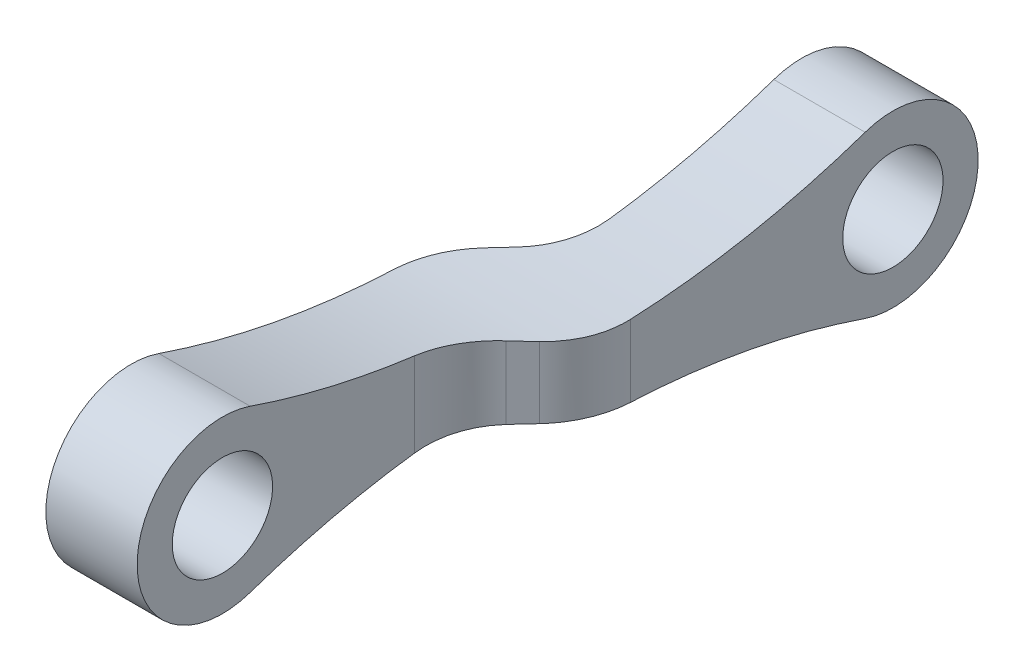
ISO-10303-21;
HEADER;
FILE_DESCRIPTION(('STEP AP214'),'2;1');
FILE_NAME('part.step','',(''),(''),'','','');
FILE_SCHEMA(('AUTOMOTIVE_DESIGN { 1 0 10303 214 1 1 1 1 }'));
ENDSEC;
DATA;
#1=APPLICATION_CONTEXT('core data for automotive mechanical design processes');
#2=APPLICATION_PROTOCOL_DEFINITION('international standard','automotive_design',2000,#1);
#3=PRODUCT_CONTEXT('',#1,'mechanical');
#4=PRODUCT('Part','Part','',(#3));
#5=PRODUCT_RELATED_PRODUCT_CATEGORY('part','',(#4));
#6=PRODUCT_DEFINITION_FORMATION('','',#4);
#7=PRODUCT_DEFINITION_CONTEXT('part definition',#1,'design');
#8=PRODUCT_DEFINITION('design','',#6,#7);
#9=PRODUCT_DEFINITION_SHAPE('','',#8);
#10=(LENGTH_UNIT() NAMED_UNIT(*) SI_UNIT(.MILLI.,.METRE.));
#11=(NAMED_UNIT(*) PLANE_ANGLE_UNIT() SI_UNIT($,.RADIAN.));
#12=(NAMED_UNIT(*) SI_UNIT($,.STERADIAN.) SOLID_ANGLE_UNIT());
#13=UNCERTAINTY_MEASURE_WITH_UNIT(LENGTH_MEASURE(1.E-05),#10,'distance_accuracy_value','');
#14=(GEOMETRIC_REPRESENTATION_CONTEXT(3) GLOBAL_UNCERTAINTY_ASSIGNED_CONTEXT((#13)) GLOBAL_UNIT_ASSIGNED_CONTEXT((#10,
#11,#12)) REPRESENTATION_CONTEXT('',''));
#15=CARTESIAN_POINT('',(0.,0.,0.));
#16=DIRECTION('',(0.,0.,1.));
#17=DIRECTION('',(1.,0.,0.));
#18=AXIS2_PLACEMENT_3D('',#15,#16,#17);
#19=CARTESIAN_POINT('',(11.5,31.0577521008403,10.68));
#20=DIRECTION('',(1.,0.,0.));
#21=DIRECTION('',(0.,0.,-1.));
#22=AXIS2_PLACEMENT_3D('',#19,#20,#21);
#23=PLANE('',#22);
#24=CARTESIAN_POINT('',(11.5,62.1155042016806,21.36));
#25=DIRECTION('',(-1.,0.,0.));
#26=DIRECTION('',(0.,0.,-1.));
#27=AXIS2_PLACEMENT_3D('',#24,#25,#26);
#28=CIRCLE('',#27,59.6155042016806);
#29=CARTESIAN_POINT('',(11.5,5.74009616104241,1.97387843141019));
#30=VERTEX_POINT('',#29);
#31=CARTESIAN_POINT('',(11.5,2.56082858975971,18.6676118445749));
#32=VERTEX_POINT('',#31);
#33=EDGE_CURVE('E325',#30,#32,#28,.T.);
#34=ORIENTED_EDGE('',*,*,#33,.T.);
#35=DIRECTION('',(0.,1.,0.));
#36=VECTOR('',#35,1.);
#37=CARTESIAN_POINT('',(11.5,-2.5,18.6676118445749));
#38=LINE('',#37,#36);
#39=CARTESIAN_POINT('',(11.5,-2.56082858975971,18.6676118445749));
#40=VERTEX_POINT('',#39);
#41=EDGE_CURVE('E60',#32,#40,#38,.F.);
#42=ORIENTED_EDGE('',*,*,#41,.T.);
#43=CARTESIAN_POINT('',(11.5,-62.1155042016806,21.36));
#44=DIRECTION('',(-1.,0.,0.));
#45=DIRECTION('',(0.,0.,1.));
#46=AXIS2_PLACEMENT_3D('',#43,#44,#45);
#47=CIRCLE('',#46,59.6155042016806);
#48=CARTESIAN_POINT('',(11.5,-5.74009616104242,1.97387843141018));
#49=VERTEX_POINT('',#48);
#50=EDGE_CURVE('E328',#40,#49,#47,.T.);
#51=ORIENTED_EDGE('',*,*,#50,.T.);
#52=CARTESIAN_POINT('',(11.5,0.,0.));
#53=DIRECTION('',(1.,0.,0.));
#54=DIRECTION('',(0.,0.,-1.));
#55=AXIS2_PLACEMENT_3D('',#52,#53,#54);
#56=CIRCLE('',#55,6.07000000000002);
#57=EDGE_CURVE('E331',#49,#30,#56,.T.);
#58=ORIENTED_EDGE('',*,*,#57,.T.);
#59=EDGE_LOOP('',(#34,#42,#51,#58));
#60=FACE_BOUND('',#59,.T.);
#61=CARTESIAN_POINT('',(11.5,0.,0.));
#62=DIRECTION('',(1.,0.,0.));
#63=DIRECTION('',(0.,0.,-1.));
#64=AXIS2_PLACEMENT_3D('',#61,#62,#63);
#65=CIRCLE('',#64,3.57);
#66=CARTESIAN_POINT('',(11.5,0.,-3.57));
#67=VERTEX_POINT('',#66);
#68=EDGE_CURVE('E288',#67,#67,#65,.T.);
#69=ORIENTED_EDGE('',*,*,#68,.F.);
#70=EDGE_LOOP('',(#69));
#71=FACE_BOUND('',#70,.T.);
#72=ADVANCED_FACE('F38',(#60,#71),#23,.T.);
#73=CARTESIAN_POINT('',(0.,31.0577521008403,10.68));
#74=DIRECTION('',(1.,0.,0.));
#75=DIRECTION('',(0.,0.,-1.));
#76=AXIS2_PLACEMENT_3D('',#73,#74,#75);
#77=PLANE('',#76);
#78=CARTESIAN_POINT('',(0.,62.1155042016806,21.36));
#79=DIRECTION('',(-1.,0.,0.));
#80=DIRECTION('',(0.,0.,-1.));
#81=AXIS2_PLACEMENT_3D('',#78,#79,#80);
#82=CIRCLE('',#81,59.6155042016806);
#83=CARTESIAN_POINT('',(0.,2.55818640429047,23.9932941349716));
#84=VERTEX_POINT('',#83);
#85=CARTESIAN_POINT('',(0.,5.74009616104237,40.7461215685898));
#86=VERTEX_POINT('',#85);
#87=EDGE_CURVE('E279',#84,#86,#82,.T.);
#88=ORIENTED_EDGE('',*,*,#87,.F.);
#89=DIRECTION('',(0.,1.,0.));
#90=VECTOR('',#89,1.);
#91=CARTESIAN_POINT('',(0.,31.0577521008403,23.9932941349716));
#92=LINE('',#91,#90);
#93=CARTESIAN_POINT('',(0.,-2.55818640429048,23.9932941349716));
#94=VERTEX_POINT('',#93);
#95=EDGE_CURVE('E274',#84,#94,#92,.F.);
#96=ORIENTED_EDGE('',*,*,#95,.T.);
#97=CARTESIAN_POINT('',(0.,-62.1155042016806,21.36));
#98=DIRECTION('',(-1.,0.,0.));
#99=DIRECTION('',(0.,0.,1.));
#100=AXIS2_PLACEMENT_3D('',#97,#98,#99);
#101=CIRCLE('',#100,59.6155042016806);
#102=CARTESIAN_POINT('',(0.,-5.74009616104239,40.7461215685898));
#103=VERTEX_POINT('',#102);
#104=EDGE_CURVE('E292',#103,#94,#101,.T.);
#105=ORIENTED_EDGE('',*,*,#104,.F.);
#106=CARTESIAN_POINT('',(0.,0.,42.72));
#107=DIRECTION('',(1.,0.,0.));
#108=DIRECTION('',(0.,0.,-1.));
#109=AXIS2_PLACEMENT_3D('',#106,#107,#108);
#110=CIRCLE('',#109,6.06999999999999);
#111=EDGE_CURVE('E160',#86,#103,#110,.T.);
#112=ORIENTED_EDGE('',*,*,#111,.F.);
#113=EDGE_LOOP('',(#88,#96,#105,#112));
#114=FACE_BOUND('',#113,.T.);
#115=CARTESIAN_POINT('',(0.,0.,42.72));
#116=DIRECTION('',(1.,0.,0.));
#117=DIRECTION('',(0.,0.,-1.));
#118=AXIS2_PLACEMENT_3D('',#115,#116,#117);
#119=CIRCLE('',#118,3.57);
#120=CARTESIAN_POINT('',(0.,0.,39.15));
#121=VERTEX_POINT('',#120);
#122=EDGE_CURVE('E318',#121,#121,#119,.T.);
#123=ORIENTED_EDGE('',*,*,#122,.T.);
#124=EDGE_LOOP('',(#123));
#125=FACE_BOUND('',#124,.T.);
#126=ADVANCED_FACE('F214',(#114,#125),#77,.F.);
#127=CARTESIAN_POINT('',(11.5,62.1155042016806,21.36));
#128=DIRECTION('',(-1.,0.,0.));
#129=DIRECTION('',(0.,0.,1.));
#130=AXIS2_PLACEMENT_3D('',#127,#128,#129);
#131=CYLINDRICAL_SURFACE('',#130,59.6155042016806);
#132=CARTESIAN_POINT('',(-0.0590940204535061,62.1155042016806,21.36));
#133=DIRECTION('',(0.707106781186549,0.,0.707106781186546));
#134=DIRECTION('',(-0.707106781186546,0.,0.707106781186549));
#135=AXIS2_PLACEMENT_3D('',#132,#133,#134);
#136=ELLIPSE('',#135,84.3090545697268,59.6155042016806);
#137=CARTESIAN_POINT('',(3.09619407771257,2.58355901056349,18.204711901834));
#138=VERTEX_POINT('',#137);
#139=CARTESIAN_POINT('',(1.90380592228744,2.53232398246615,19.3971000572591));
#140=VERTEX_POINT('',#139);
#141=EDGE_CURVE('E281',#138,#140,#136,.F.);
#142=ORIENTED_EDGE('',*,*,#141,.T.);
#143=CARTESIAN_POINT('',(1.90380592228743,2.53232398246615,19.3971000572591));
#144=CARTESIAN_POINT('',(1.77499707379957,2.52807908157983,19.5258816176791));
#145=CARTESIAN_POINT('',(1.65162583039582,2.52407728502969,19.6601063788568));
#146=CARTESIAN_POINT('',(1.41656618937471,2.51678927245583,19.9384433693172));
#147=CARTESIAN_POINT('',(1.3048778930099,2.51350306263361,20.0825556842744));
#148=CARTESIAN_POINT('',(1.0939115073686,2.50787347447107,20.3797828642251));
#149=CARTESIAN_POINT('',(0.994643200635603,2.50553083614724,20.5329046876832));
#150=CARTESIAN_POINT('',(0.809326883675707,2.50200094297654,20.8469510973131));
#151=CARTESIAN_POINT('',(0.723278143556792,2.50081362432167,21.0078752520488));
#152=CARTESIAN_POINT('',(0.56494398448552,2.49977797404695,21.3365273506703));
#153=CARTESIAN_POINT('',(0.49267007767478,2.49993075743022,21.5042608446149));
#154=CARTESIAN_POINT('',(0.362491207977645,2.50173085566118,21.8452062707204));
#155=CARTESIAN_POINT('',(0.304586133934346,2.50337815894684,22.0184181604889));
#156=CARTESIAN_POINT('',(0.203648732968843,2.50827818485279,22.3687529402186));
#157=CARTESIAN_POINT('',(0.160589407884079,2.51152796679201,22.5458681007442));
#158=CARTESIAN_POINT('',(0.0895134439839548,2.51970379952949,22.9029804806161));
#159=CARTESIAN_POINT('',(0.0614895816375497,2.52462904351881,23.0829762731294));
#160=CARTESIAN_POINT('',(0.027379904361948,2.53427742196616,23.3849609010242));
#161=CARTESIAN_POINT('',(0.0171073287550954,2.53853177341081,23.5065080296951));
#162=CARTESIAN_POINT('',(0.00342060141856039,2.54779463893131,23.7498030339737));
#163=CARTESIAN_POINT('',(-2.30212156742511E-06,2.5528021818443,23.8715504542422));
#164=CARTESIAN_POINT('',(0.,2.55818640429047,23.9932941349716));
#165=B_SPLINE_CURVE_WITH_KNOTS('',3,(#143,#144,#145,#146,#147,#148,#149,#150,#151,#152,#153,
#154,#155,#156,#157,#158,#159,#160,#161,#162,#163,#164),.UNSPECIFIED.,.F.,.F.,(4,2,2,2,2,2,2,2,
2,2,4),(0.,0.546416077265279,1.09283688976022,1.63968541413357,2.18650373449626,
2.73377706642366,3.2810461645273,3.82731469512343,4.37332054479895,4.73930213279695,
5.10481580761997),.UNSPECIFIED.);
#166=EDGE_CURVE('E203',#140,#84,#165,.T.);
#167=ORIENTED_EDGE('',*,*,#166,.T.);
#168=ORIENTED_EDGE('',*,*,#87,.T.);
#169=DIRECTION('',(-1.,0.,0.));
#170=VECTOR('',#169,1.);
#171=CARTESIAN_POINT('',(11.5,5.74009616104237,40.7461215685898));
#172=LINE('',#171,#170);
#173=CARTESIAN_POINT('',(6.5,5.74009616104237,40.7461215685898));
#174=VERTEX_POINT('',#173);
#175=EDGE_CURVE('E163',#174,#86,#172,.T.);
#176=ORIENTED_EDGE('',*,*,#175,.F.);
#177=CARTESIAN_POINT('',(6.5,62.1155042016806,21.36));
#178=DIRECTION('',(-1.,0.,0.));
#179=DIRECTION('',(0.,0.,1.));
#180=AXIS2_PLACEMENT_3D('',#177,#178,#179);
#181=CIRCLE('',#180,59.6155042016806);
#182=CARTESIAN_POINT('',(6.5,2.9983704273942,29.0523881554252));
#183=VERTEX_POINT('',#182);
#184=EDGE_CURVE('E152',#174,#183,#181,.F.);
#185=ORIENTED_EDGE('',*,*,#184,.T.);
#186=CARTESIAN_POINT('',(6.5,2.9983704273942,29.0523881554252));
#187=CARTESIAN_POINT('',(6.49998033445621,2.97473937083614,28.8708449321185));
#188=CARTESIAN_POINT('',(6.50760497315867,2.95196069175335,28.6891890934745));
#189=CARTESIAN_POINT('',(6.53805889459466,2.90821365764182,28.3269296185915));
#190=CARTESIAN_POINT('',(6.56088880383312,2.88724537724741,28.1463260260177));
#191=CARTESIAN_POINT('',(6.6216959220554,2.84720913945275,27.7873064049504));
#192=CARTESIAN_POINT('',(6.65968638783377,2.82814286350289,27.6088924322289));
#193=CARTESIAN_POINT('',(6.75058382056682,2.79198108786003,27.2557135473987));
#194=CARTESIAN_POINT('',(6.80348980911703,2.77488545900328,27.0809483967478));
#195=CARTESIAN_POINT('',(6.92394390092746,2.74265444414829,26.7361576033529));
#196=CARTESIAN_POINT('',(6.99150635967117,2.72752100342686,26.5661367931066));
#197=CARTESIAN_POINT('',(7.14079146330185,2.69919771418741,26.2322617477932));
#198=CARTESIAN_POINT('',(7.2225139811018,2.68600784822769,26.0684074573973));
#199=CARTESIAN_POINT('',(7.39938703265318,2.66152016643046,25.7483752494452));
#200=CARTESIAN_POINT('',(7.49451202760224,2.65021883944708,25.5921834767144));
#201=CARTESIAN_POINT('',(7.69760464661975,2.62937499335367,25.2883518337271));
#202=CARTESIAN_POINT('',(7.80556598921076,2.6198316197689,25.1407078327792));
#203=CARTESIAN_POINT('',(7.99516950567496,2.60530664677979,24.9031266281022));
#204=CARTESIAN_POINT('',(8.07343258612251,2.59987106154216,24.8104988504264));
#205=CARTESIAN_POINT('',(8.2349318485822,2.5896731522277,24.6298559518194));
#206=CARTESIAN_POINT('',(8.31816166326589,2.58490999140951,24.541835185506));
#207=CARTESIAN_POINT('',(8.4038059222874,2.58045634368577,24.4561940777127));
#208=B_SPLINE_CURVE_WITH_KNOTS('',3,(#186,#187,#188,#189,#190,#191,#192,#193,#194,#195,#196,
#197,#198,#199,#200,#201,#202,#203,#204,#205,#206,#207),.UNSPECIFIED.,.F.,.F.,(4,2,2,2,2,2,2,2,
2,2,4),(0.,0.549066119188704,1.09815486302658,1.64772480047779,2.19725869650866,
2.74733329114686,3.29740294910194,3.8464382641544,4.3952060056157,4.75918571474846,
5.12270843081804),.UNSPECIFIED.);
#209=CARTESIAN_POINT('',(8.40380592228742,2.58045634368576,24.4561940777126));
#210=VERTEX_POINT('',#209);
#211=EDGE_CURVE('E53',#183,#210,#208,.T.);
#212=ORIENTED_EDGE('',*,*,#211,.T.);
#213=CARTESIAN_POINT('',(11.5,62.1155042016806,21.36));
#214=DIRECTION('',(-0.707106781186553,0.,-0.707106781186542));
#215=DIRECTION('',(-0.707106781186542,0.,0.707106781186553));
#216=AXIS2_PLACEMENT_3D('',#213,#214,#215);
#217=ELLIPSE('',#216,84.3090545697262,59.6155042016806);
#218=CARTESIAN_POINT('',(9.59619407771262,2.53040653262528,23.2638059222874));
#219=VERTEX_POINT('',#218);
#220=EDGE_CURVE('E311',#210,#219,#217,.F.);
#221=ORIENTED_EDGE('',*,*,#220,.T.);
#222=CARTESIAN_POINT('',(9.5961940777126,2.53040653262528,23.2638059222874));
#223=CARTESIAN_POINT('',(9.72499968700732,2.52628959306561,23.1350276214524));
#224=CARTESIAN_POINT('',(9.84836791142831,2.52242110869448,23.0008064062285));
#225=CARTESIAN_POINT('',(10.0834219154513,2.51540941983826,22.7224772990121));
#226=CARTESIAN_POINT('',(10.1951075952543,2.5122662215487,22.5783693225786));
#227=CARTESIAN_POINT('',(10.4060687110771,2.50693147626502,22.2811524049213));
#228=CARTESIAN_POINT('',(10.5053344156984,2.50474067221393,22.1280365421561));
#229=CARTESIAN_POINT('',(10.690646109424,2.5015220470532,21.8140033304311));
#230=CARTESIAN_POINT('',(10.776692828137,2.5004941617375,21.653086412688));
#231=CARTESIAN_POINT('',(10.9350236353535,2.49978397596739,21.3244504106536));
#232=CARTESIAN_POINT('',(11.0072962224896,2.50010279490777,21.1567257824405));
#233=CARTESIAN_POINT('',(11.1374734991478,2.50224023469482,20.8157997524411));
#234=CARTESIAN_POINT('',(11.1953782988873,2.5040588440359,20.6425983926791));
#235=CARTESIAN_POINT('',(11.2963166336608,2.50930519591122,20.292286087515));
#236=CARTESIAN_POINT('',(11.3393771379696,2.51272999328712,20.1151828608154));
#237=CARTESIAN_POINT('',(11.4104572085034,2.52125854898121,19.758096019308));
#238=CARTESIAN_POINT('',(11.438483994316,2.52636149950342,19.5781138298961));
#239=CARTESIAN_POINT('',(11.4726052343011,2.53630931925915,19.2761100218506));
#240=CARTESIAN_POINT('',(11.4828834221015,2.54068528237763,19.154529451717));
#241=CARTESIAN_POINT('',(11.4965775766205,2.55019203853176,18.9111681877307));
#242=CARTESIAN_POINT('',(11.5000023063316,2.55532185864257,18.7893879489488));
#243=CARTESIAN_POINT('',(11.5,2.56082858975971,18.6676118445749));
#244=B_SPLINE_CURVE_WITH_KNOTS('',3,(#222,#223,#224,#225,#226,#227,#228,#229,#230,#231,#232,
#233,#234,#235,#236,#237,#238,#239,#240,#241,#242,#243),.UNSPECIFIED.,.F.,.F.,(4,2,2,2,2,2,2,2,
2,2,4),(0.,0.546393490601046,1.09279164842697,1.63961527861437,2.18640871657284,2.7336567443987,
3.28090057406918,3.82714485966285,4.3731265889808,4.739222236412,5.10484948549957),.UNSPECIFIED.);
#245=EDGE_CURVE('E195',#219,#32,#244,.T.);
#246=ORIENTED_EDGE('',*,*,#245,.T.);
#247=ORIENTED_EDGE('',*,*,#33,.F.);
#248=DIRECTION('',(-1.,0.,0.));
#249=VECTOR('',#248,1.);
#250=CARTESIAN_POINT('',(11.5,5.74009616104241,1.97387843141019));
#251=LINE('',#250,#249);
#252=CARTESIAN_POINT('',(5.,5.74009616104241,1.97387843141019));
#253=VERTEX_POINT('',#252);
#254=EDGE_CURVE('E171',#30,#253,#251,.T.);
#255=ORIENTED_EDGE('',*,*,#254,.T.);
#256=CARTESIAN_POINT('',(5.,62.1155042016806,21.36));
#257=DIRECTION('',(1.,0.,0.));
#258=DIRECTION('',(0.,0.,-1.));
#259=AXIS2_PLACEMENT_3D('',#256,#257,#258);
#260=CIRCLE('',#259,59.6155042016806);
#261=CARTESIAN_POINT('',(5.,3.00608984747105,13.6085178241214));
#262=VERTEX_POINT('',#261);
#263=EDGE_CURVE('E301',#253,#262,#260,.F.);
#264=ORIENTED_EDGE('',*,*,#263,.T.);
#265=CARTESIAN_POINT('',(5.,3.00608984747105,13.6085178241214));
#266=CARTESIAN_POINT('',(5.00001965560204,2.98227369150359,13.7900649792087));
#267=CARTESIAN_POINT('',(4.99239469586501,2.9593100520927,13.9717256816289));
#268=CARTESIAN_POINT('',(4.96193897101887,2.91519463726919,14.3339969012155));
#269=CARTESIAN_POINT('',(4.93910756843819,2.89404293785714,14.5146073740348));
#270=CARTESIAN_POINT('',(4.87829557558409,2.85364243099122,14.8736437633579));
#271=CARTESIAN_POINT('',(4.84030163463379,2.83439531922268,15.0520676114461));
#272=CARTESIAN_POINT('',(4.74939483208519,2.79787606181507,15.4052678495778));
#273=CARTESIAN_POINT('',(4.69648295204889,2.7806037863419,15.5800444787865));
#274=CARTESIAN_POINT('',(4.57601393355463,2.74802469012818,15.924860130624));
#275=CARTESIAN_POINT('',(4.50844238117828,2.73271982757431,16.09489430327));
#276=CARTESIAN_POINT('',(4.3591356892656,2.70406040319475,16.4287966703125));
#277=CARTESIAN_POINT('',(4.27740067833853,2.69070582366182,16.5926649206813));
#278=CARTESIAN_POINT('',(4.10049927433063,2.66589693979961,16.9127244685842));
#279=CARTESIAN_POINT('',(4.00535846561937,2.654439104163,17.0689296424749));
#280=CARTESIAN_POINT('',(3.80223058969418,2.63329124872846,17.3727872324465));
#281=CARTESIAN_POINT('',(3.69424980978996,2.62360036955173,17.520443782268));
#282=CARTESIAN_POINT('',(3.50465503699426,2.60884179534635,17.7579893543268));
#283=CARTESIAN_POINT('',(3.42642420425118,2.60331689687534,17.8505718797216));
#284=CARTESIAN_POINT('',(3.26499354204235,2.59294435663301,18.0311289135854));
#285=CARTESIAN_POINT('',(3.18180006768143,2.58809587414601,18.1191090557365));
#286=CARTESIAN_POINT('',(3.09619407771257,2.5835590105635,18.204711901834));
#287=B_SPLINE_CURVE_WITH_KNOTS('',3,(#265,#266,#267,#268,#269,#270,#271,#272,#273,#274,#275,
#276,#277,#278,#279,#280,#281,#282,#283,#284,#285,#286),.UNSPECIFIED.,.F.,.F.,(4,2,2,2,2,2,2,2,
2,2,4),(0.,0.549149846456014,1.09832271535389,1.64798020386502,2.19760153476485,
2.74776574233622,3.29792495448218,3.84704808588954,4.39590342861602,4.75972951919093,
5.12309930396841),.UNSPECIFIED.);
#288=EDGE_CURVE('E223',#262,#138,#287,.T.);
#289=ORIENTED_EDGE('',*,*,#288,.T.);
#290=EDGE_LOOP('',(#142,#167,#168,#176,#185,#212,#221,#246,#247,#255,#264,#289));
#291=FACE_BOUND('',#290,.T.);
#292=ADVANCED_FACE('F210',(#291),#131,.F.);
#293=CARTESIAN_POINT('',(11.5,0.,42.72));
#294=DIRECTION('',(-1.,0.,0.));
#295=DIRECTION('',(0.,0.,1.));
#296=AXIS2_PLACEMENT_3D('',#293,#294,#295);
#297=CYLINDRICAL_SURFACE('',#296,6.06999999999999);
#298=DIRECTION('',(-1.,0.,0.));
#299=VECTOR('',#298,1.);
#300=CARTESIAN_POINT('',(11.5,-5.74009616104239,40.7461215685898));
#301=LINE('',#300,#299);
#302=CARTESIAN_POINT('',(6.5,-5.74009616104238,40.7461215685898));
#303=VERTEX_POINT('',#302);
#304=EDGE_CURVE('E138',#303,#103,#301,.T.);
#305=ORIENTED_EDGE('',*,*,#304,.F.);
#306=CARTESIAN_POINT('',(6.5,0.,42.72));
#307=DIRECTION('',(-1.,0.,0.));
#308=DIRECTION('',(0.,0.,1.));
#309=AXIS2_PLACEMENT_3D('',#306,#307,#308);
#310=CIRCLE('',#309,6.06999999999999);
#311=EDGE_CURVE('E146',#303,#174,#310,.T.);
#312=ORIENTED_EDGE('',*,*,#311,.T.);
#313=ORIENTED_EDGE('',*,*,#175,.T.);
#314=ORIENTED_EDGE('',*,*,#111,.T.);
#315=EDGE_LOOP('',(#305,#312,#313,#314));
#316=FACE_BOUND('',#315,.T.);
#317=ADVANCED_FACE('F158',(#316),#297,.T.);
#318=CARTESIAN_POINT('',(11.5,-62.1155042016806,21.36));
#319=DIRECTION('',(-1.,0.,0.));
#320=DIRECTION('',(0.,0.,1.));
#321=AXIS2_PLACEMENT_3D('',#318,#319,#320);
#322=CYLINDRICAL_SURFACE('',#321,59.6155042016806);
#323=ORIENTED_EDGE('',*,*,#104,.T.);
#324=CARTESIAN_POINT('',(0.,-2.55818640429048,23.9932941349716));
#325=CARTESIAN_POINT('',(-2.01750914067656E-05,-2.55014533112662,23.81161724762));
#326=CARTESIAN_POINT('',(0.00761606760777063,-2.54295198647263,23.6299048652683));
#327=CARTESIAN_POINT('',(0.0380752074569941,-2.53025774302818,23.2676997221754));
#328=CARTESIAN_POINT('',(0.0608979252025268,-2.52475682424548,23.087206947052));
#329=CARTESIAN_POINT('',(0.121619517393619,-2.51544182648257,22.7286346958568));
#330=CARTESIAN_POINT('',(0.159526172882089,-2.51162862025596,22.5505565144556));
#331=CARTESIAN_POINT('',(0.250145009983029,-2.50563245034597,22.1981898388687));
#332=CARTESIAN_POINT('',(0.302856442289803,-2.50344940417669,22.0239011533683));
#333=CARTESIAN_POINT('',(0.422758073526323,-2.50061214634901,21.6802274256419));
#334=CARTESIAN_POINT('',(0.489958426077714,-2.49995901065705,21.510845917205));
#335=CARTESIAN_POINT('',(0.638338751419513,-2.50004497602501,21.1783210844053));
#336=CARTESIAN_POINT('',(0.719518689913621,-2.50078407366941,21.0151777447395));
#337=CARTESIAN_POINT('',(0.895126183032082,-2.50347908407542,20.6965648126395));
#338=CARTESIAN_POINT('',(0.989530779781643,-2.50543290787532,20.5410825398621));
#339=CARTESIAN_POINT('',(1.19098841981634,-2.51035537078107,20.2386454411844));
#340=CARTESIAN_POINT('',(1.29803548362458,-2.5133235313864,20.0916866326147));
#341=CARTESIAN_POINT('',(1.48788023483061,-2.51897768090335,19.8527719745975));
#342=CARTESIAN_POINT('',(1.56748571805584,-2.52145037651256,19.7582552797756));
#343=CARTESIAN_POINT('',(1.73183614217319,-2.52668677562751,19.5740367368764));
#344=CARTESIAN_POINT('',(1.81657407049969,-2.52945008570173,19.4843286213182));
#345=CARTESIAN_POINT('',(1.90380592228743,-2.53232398246617,19.3971000572591));
#346=B_SPLINE_CURVE_WITH_KNOTS('',3,(#324,#325,#326,#327,#328,#329,#330,#331,#332,#333,#334,
#335,#336,#337,#338,#339,#340,#341,#342,#343,#344,#345),.UNSPECIFIED.,.F.,.F.,(4,2,2,2,2,2,2,2,
2,2,4),(0.,0.545399139911809,1.09079183689793,1.63646623995291,2.18211303007691,
2.72814345153096,3.27417253342055,3.81926519785286,4.36410107589088,4.7347078892674,
5.10481928370267),.UNSPECIFIED.);
#347=CARTESIAN_POINT('',(1.90380592228745,-2.53232398246616,19.3971000572591));
#348=VERTEX_POINT('',#347);
#349=EDGE_CURVE('E268',#94,#348,#346,.T.);
#350=ORIENTED_EDGE('',*,*,#349,.T.);
#351=CARTESIAN_POINT('',(-0.0590940204535061,-62.1155042016806,21.36));
#352=DIRECTION('',(0.707106781186549,0.,0.707106781186546));
#353=DIRECTION('',(-0.707106781186546,0.,0.707106781186549));
#354=AXIS2_PLACEMENT_3D('',#351,#352,#353);
#355=ELLIPSE('',#354,84.3090545697267,59.6155042016806);
#356=CARTESIAN_POINT('',(3.09619407771255,-2.58355901056349,18.204711901834));
#357=VERTEX_POINT('',#356);
#358=EDGE_CURVE('E168',#348,#357,#355,.F.);
#359=ORIENTED_EDGE('',*,*,#358,.T.);
#360=CARTESIAN_POINT('',(3.09619407771257,-2.58355901056349,18.204711901834));
#361=CARTESIAN_POINT('',(3.22505952061027,-2.59038513424046,18.0758755646489));
#362=CARTESIAN_POINT('',(3.34845733648833,-2.5979228386317,17.9416131821179));
#363=CARTESIAN_POINT('',(3.58351152040751,-2.61456396117034,17.6632704993417));
#364=CARTESIAN_POINT('',(3.69516810577897,-2.62366735032868,17.5191903809043));
#365=CARTESIAN_POINT('',(3.90597545537524,-2.64358613197757,17.2221894389828));
#366=CARTESIAN_POINT('',(4.00512181638278,-2.65440212424862,17.069265530219));
#367=CARTESIAN_POINT('',(4.19017252198982,-2.67785692456948,16.7557489828351));
#368=CARTESIAN_POINT('',(4.2760775167185,-2.69049564306743,16.5951567212258));
#369=CARTESIAN_POINT('',(4.43411516235153,-2.71768975212381,16.2673538792913));
#370=CARTESIAN_POINT('',(4.50623840967155,-2.73224643999293,16.100138873381));
#371=CARTESIAN_POINT('',(4.63615820785973,-2.76331796658385,15.7604088489896));
#372=CARTESIAN_POINT('',(4.69395476538185,-2.77983280439619,15.5878938329701));
#373=CARTESIAN_POINT('',(4.79476679290722,-2.81479885351414,15.2391049615559));
#374=CARTESIAN_POINT('',(4.8378064233938,-2.83324683452384,15.0628377568729));
#375=CARTESIAN_POINT('',(4.90896395904899,-2.87205923441276,14.7075965736036));
#376=CARTESIAN_POINT('',(4.9370887574996,-2.89242276283865,14.5286238848345));
#377=CARTESIAN_POINT('',(4.97180266115446,-2.92827718264762,14.2258663880417));
#378=CARTESIAN_POINT('',(4.98238554453282,-2.94328088432458,14.1024668110292));
#379=CARTESIAN_POINT('',(4.99648057108079,-2.97408991031364,13.8555373690856));
#380=CARTESIAN_POINT('',(5.00000243412904,-2.98989410191914,13.7320079177787));
#381=CARTESIAN_POINT('',(5.,-3.00608984747105,13.6085178241214));
#382=B_SPLINE_CURVE_WITH_KNOTS('',3,(#360,#361,#362,#363,#364,#365,#366,#367,#368,#369,#370,
#371,#372,#373,#374,#375,#376,#377,#378,#379,#380,#381),.UNSPECIFIED.,.F.,.F.,(4,2,2,2,2,2,2,2,
2,2,4),(0.,0.546884385991536,1.09375864736243,1.64082485802882,2.1878642000885,2.73527547644153,
3.28268649855224,3.82919695474939,4.37545460614218,4.74953821253899,5.12310651796549),.UNSPECIFIED.);
#383=CARTESIAN_POINT('',(5.,-3.00608984747106,13.6085178241214));
#384=VERTEX_POINT('',#383);
#385=EDGE_CURVE('E68',#357,#384,#382,.T.);
#386=ORIENTED_EDGE('',*,*,#385,.T.);
#387=CARTESIAN_POINT('',(5.,-62.1155042016806,21.36));
#388=DIRECTION('',(1.,0.,0.));
#389=DIRECTION('',(0.,0.,-1.));
#390=AXIS2_PLACEMENT_3D('',#387,#388,#389);
#391=CIRCLE('',#390,59.6155042016806);
#392=CARTESIAN_POINT('',(5.,-5.74009616104241,1.97387843141018));
#393=VERTEX_POINT('',#392);
#394=EDGE_CURVE('E182',#384,#393,#391,.F.);
#395=ORIENTED_EDGE('',*,*,#394,.T.);
#396=DIRECTION('',(-1.,0.,0.));
#397=VECTOR('',#396,1.);
#398=CARTESIAN_POINT('',(11.5,-5.74009616104242,1.97387843141018));
#399=LINE('',#398,#397);
#400=EDGE_CURVE('E164',#49,#393,#399,.T.);
#401=ORIENTED_EDGE('',*,*,#400,.F.);
#402=ORIENTED_EDGE('',*,*,#50,.F.);
#403=CARTESIAN_POINT('',(11.5,-2.56082858975971,18.6676118445749));
#404=CARTESIAN_POINT('',(11.5000201729962,-2.55260719880371,18.8492818705996));
#405=CARTESIAN_POINT('',(11.4923845066611,-2.54523350923222,19.0309882731509));
#406=CARTESIAN_POINT('',(11.4619272213717,-2.53217980086627,19.3931833736911));
#407=CARTESIAN_POINT('',(11.4391057738036,-2.52649976295835,19.5736720853997));
#408=CARTESIAN_POINT('',(11.3783868966903,-2.51682893187225,19.9322385157965));
#409=CARTESIAN_POINT('',(11.3404816499856,-2.51283901681504,20.1103149347575));
#410=CARTESIAN_POINT('',(11.2498653975177,-2.50649322520403,20.4626797815063));
#411=CARTESIAN_POINT('',(11.1971551433091,-2.50413726572592,20.6369684010924));
#412=CARTESIAN_POINT('',(11.0772551238154,-2.50095907834078,20.9806439454839));
#413=CARTESIAN_POINT('',(11.0100551640896,-2.50013793422818,21.1500273234719));
#414=CARTESIAN_POINT('',(10.8616747299554,-2.49989411073281,21.4825569653393));
#415=CARTESIAN_POINT('',(10.7804942905299,-2.50047142785075,21.6457032448244));
#416=CARTESIAN_POINT('',(10.6048848718262,-2.50285051374329,21.9643225459963));
#417=CARTESIAN_POINT('',(10.5104788663132,-2.50465017963868,22.1198082547009));
#418=CARTESIAN_POINT('',(10.3090174208141,-2.50927278882241,22.4222524734549));
#419=CARTESIAN_POINT('',(10.2019679617201,-2.51209524958169,22.5692149666805));
#420=CARTESIAN_POINT('',(10.0121204009451,-2.51751246229574,22.8081332350359));
#421=CARTESIAN_POINT('',(9.93251488081546,-2.519891376739,22.9026500054299));
#422=CARTESIAN_POINT('',(9.76816424496586,-2.52494496107189,23.086868831781));
#423=CARTESIAN_POINT('',(9.68342613912567,-2.52761923151316,23.1765771525956));
#424=CARTESIAN_POINT('',(9.5961940777126,-2.53040653262528,23.2638059222874));
#425=B_SPLINE_CURVE_WITH_KNOTS('',3,(#403,#404,#405,#406,#407,#408,#409,#410,#411,#412,#413,
#414,#415,#416,#417,#418,#419,#420,#421,#422,#423,#424),.UNSPECIFIED.,.F.,.F.,(4,2,2,2,2,2,2,2,
2,2,4),(0.,0.545402847955338,1.09079954061739,1.63647925329472,2.18213127034681,
2.72816844873318,3.27420426080992,3.8193030664537,4.36414504218355,4.73474656529339,
5.10485287527584),.UNSPECIFIED.);
#426=CARTESIAN_POINT('',(9.5961940777126,-2.53040653262528,23.2638059222874));
#427=VERTEX_POINT('',#426);
#428=EDGE_CURVE('E271',#40,#427,#425,.T.);
#429=ORIENTED_EDGE('',*,*,#428,.T.);
#430=CARTESIAN_POINT('',(11.5,-62.1155042016806,21.36));
#431=DIRECTION('',(-0.707106781186553,0.,-0.707106781186542));
#432=DIRECTION('',(-0.707106781186542,0.,0.707106781186553));
#433=AXIS2_PLACEMENT_3D('',#430,#431,#432);
#434=ELLIPSE('',#433,84.3090545697262,59.6155042016806);
#435=CARTESIAN_POINT('',(8.4038059222874,-2.58045634368576,24.4561940777126));
#436=VERTEX_POINT('',#435);
#437=EDGE_CURVE('E185',#427,#436,#434,.F.);
#438=ORIENTED_EDGE('',*,*,#437,.T.);
#439=CARTESIAN_POINT('',(8.4038059222874,-2.58045634368577,24.4561940777126));
#440=CARTESIAN_POINT('',(8.2749450083824,-2.58715399721918,24.5850259076087));
#441=CARTESIAN_POINT('',(8.15155080466708,-2.59455773776597,24.7192838983688));
#442=CARTESIAN_POINT('',(7.91650208641447,-2.6109209672871,24.9976186277696));
#443=CARTESIAN_POINT('',(7.80484736054119,-2.6198804282474,25.1416951895779));
#444=CARTESIAN_POINT('',(7.59404155546123,-2.63950240488559,25.4386911923377));
#445=CARTESIAN_POINT('',(7.49489495320385,-2.65016552726613,25.5916137710826));
#446=CARTESIAN_POINT('',(7.3098426874804,-2.67330677131308,25.905129496064));
#447=CARTESIAN_POINT('',(7.22393637230261,-2.68578480358742,26.0657222642496));
#448=CARTESIAN_POINT('',(7.06589519462069,-2.71265081958282,26.3935288020547));
#449=CARTESIAN_POINT('',(6.99376977398641,-2.72704010142015,26.5607470170107));
#450=CARTESIAN_POINT('',(6.86384557342471,-2.75777139607021,26.9004859325067));
#451=CARTESIAN_POINT('',(6.80604678536249,-2.77411340777415,27.0730066300359));
#452=CARTESIAN_POINT('',(6.70523095035063,-2.80872989226689,27.4218089769062));
#453=CARTESIAN_POINT('',(6.66218970608349,-2.82700113679544,27.598083961434));
#454=CARTESIAN_POINT('',(6.59103001065367,-2.86545723057365,27.9533430933618));
#455=CARTESIAN_POINT('',(6.56290466248663,-2.88564119029956,28.1323259492147));
#456=CARTESIAN_POINT('',(6.52819324325852,-2.92118963847908,28.4350845841625));
#457=CARTESIAN_POINT('',(6.51761194303064,-2.93606723813181,28.5584744797146));
#458=CARTESIAN_POINT('',(6.50351895810091,-2.96662364128986,28.8053855560956));
#459=CARTESIAN_POINT('',(6.49999756463027,-2.9823013140487,28.9289063225848));
#460=CARTESIAN_POINT('',(6.5,-2.99837042739421,29.0523881554252));
#461=B_SPLINE_CURVE_WITH_KNOTS('',3,(#439,#440,#441,#442,#443,#444,#445,#446,#447,#448,#449,
#450,#451,#452,#453,#454,#455,#456,#457,#458,#459,#460),.UNSPECIFIED.,.F.,.F.,(4,2,2,2,2,2,2,2,
2,2,4),(0.,0.546851013352966,1.09369218051838,1.64072852292336,2.18773793057076,
2.73512078390169,3.28250332642226,3.8289840081954,4.37521178038138,4.74922097397669,
5.12271547715148),.UNSPECIFIED.);
#462=CARTESIAN_POINT('',(6.5,-2.99837042739421,29.0523881554252));
#463=VERTEX_POINT('',#462);
#464=EDGE_CURVE('E11',#436,#463,#461,.T.);
#465=ORIENTED_EDGE('',*,*,#464,.T.);
#466=CARTESIAN_POINT('',(6.5,-62.1155042016806,21.36));
#467=DIRECTION('',(-1.,0.,0.));
#468=DIRECTION('',(0.,0.,1.));
#469=AXIS2_PLACEMENT_3D('',#466,#467,#468);
#470=CIRCLE('',#469,59.6155042016806);
#471=EDGE_CURVE('E133',#463,#303,#470,.F.);
#472=ORIENTED_EDGE('',*,*,#471,.T.);
#473=ORIENTED_EDGE('',*,*,#304,.T.);
#474=EDGE_LOOP('',(#323,#350,#359,#386,#395,#401,#402,#429,#438,#465,#472,#473));
#475=FACE_BOUND('',#474,.T.);
#476=ADVANCED_FACE('F136',(#475),#322,.F.);
#477=CARTESIAN_POINT('',(11.5,0.,0.));
#478=DIRECTION('',(-1.,0.,0.));
#479=DIRECTION('',(0.,0.,1.));
#480=AXIS2_PLACEMENT_3D('',#477,#478,#479);
#481=CYLINDRICAL_SURFACE('',#480,6.07000000000002);
#482=ORIENTED_EDGE('',*,*,#400,.T.);
#483=CARTESIAN_POINT('',(5.,0.,0.));
#484=DIRECTION('',(1.,0.,0.));
#485=DIRECTION('',(0.,0.,-1.));
#486=AXIS2_PLACEMENT_3D('',#483,#484,#485);
#487=CIRCLE('',#486,6.07000000000002);
#488=EDGE_CURVE('E307',#393,#253,#487,.T.);
#489=ORIENTED_EDGE('',*,*,#488,.T.);
#490=ORIENTED_EDGE('',*,*,#254,.F.);
#491=ORIENTED_EDGE('',*,*,#57,.F.);
#492=EDGE_LOOP('',(#482,#489,#490,#491));
#493=FACE_BOUND('',#492,.T.);
#494=ADVANCED_FACE('F342',(#493),#481,.T.);
#495=CARTESIAN_POINT('',(11.5,0.,0.));
#496=DIRECTION('',(-1.,0.,0.));
#497=DIRECTION('',(0.,0.,1.));
#498=AXIS2_PLACEMENT_3D('',#495,#496,#497);
#499=CYLINDRICAL_SURFACE('',#498,3.57);
#500=CARTESIAN_POINT('',(5.,0.,0.));
#501=DIRECTION('',(1.,0.,0.));
#502=DIRECTION('',(0.,0.,-1.));
#503=AXIS2_PLACEMENT_3D('',#500,#501,#502);
#504=CIRCLE('',#503,3.57);
#505=CARTESIAN_POINT('',(5.,0.,-3.57));
#506=VERTEX_POINT('',#505);
#507=EDGE_CURVE('E178',#506,#506,#504,.T.);
#508=ORIENTED_EDGE('',*,*,#507,.F.);
#509=EDGE_LOOP('',(#508));
#510=FACE_BOUND('',#509,.T.);
#511=ORIENTED_EDGE('',*,*,#68,.T.);
#512=EDGE_LOOP('',(#511));
#513=FACE_BOUND('',#512,.T.);
#514=ADVANCED_FACE('F363',(#510,#513),#499,.F.);
#515=CARTESIAN_POINT('',(11.5,0.,42.72));
#516=DIRECTION('',(-1.,0.,0.));
#517=DIRECTION('',(0.,0.,1.));
#518=AXIS2_PLACEMENT_3D('',#515,#516,#517);
#519=CYLINDRICAL_SURFACE('',#518,3.57);
#520=CARTESIAN_POINT('',(6.5,0.,42.72));
#521=DIRECTION('',(-1.,0.,0.));
#522=DIRECTION('',(0.,0.,1.));
#523=AXIS2_PLACEMENT_3D('',#520,#521,#522);
#524=CIRCLE('',#523,3.57);
#525=CARTESIAN_POINT('',(6.5,0.,46.29));
#526=VERTEX_POINT('',#525);
#527=EDGE_CURVE('E147',#526,#526,#524,.T.);
#528=ORIENTED_EDGE('',*,*,#527,.F.);
#529=EDGE_LOOP('',(#528));
#530=FACE_BOUND('',#529,.T.);
#531=ORIENTED_EDGE('',*,*,#122,.F.);
#532=EDGE_LOOP('',(#531));
#533=FACE_BOUND('',#532,.T.);
#534=ADVANCED_FACE('F354',(#530,#533),#519,.F.);
#535=CARTESIAN_POINT('',(11.5,-6.07000000000002,21.36));
#536=DIRECTION('',(-0.707106781186553,0.,-0.707106781186542));
#537=DIRECTION('',(-0.707106781186542,0.,0.707106781186553));
#538=AXIS2_PLACEMENT_3D('',#535,#536,#537);
#539=PLANE('',#538);
#540=ORIENTED_EDGE('',*,*,#220,.F.);
#541=DIRECTION('',(0.,1.,0.));
#542=VECTOR('',#541,1.);
#543=CARTESIAN_POINT('',(8.4038059222874,-2.71004703467786,24.4561940777126));
#544=LINE('',#543,#542);
#545=EDGE_CURVE('E256',#210,#436,#544,.F.);
#546=ORIENTED_EDGE('',*,*,#545,.T.);
#547=ORIENTED_EDGE('',*,*,#437,.F.);
#548=DIRECTION('',(0.,1.,0.));
#549=VECTOR('',#548,1.);
#550=CARTESIAN_POINT('',(9.5961940777126,2.49999999999999,23.2638059222874));
#551=LINE('',#550,#549);
#552=EDGE_CURVE('E258',#427,#219,#551,.T.);
#553=ORIENTED_EDGE('',*,*,#552,.T.);
#554=EDGE_LOOP('',(#540,#546,#547,#553));
#555=FACE_BOUND('',#554,.T.);
#556=ADVANCED_FACE('F348',(#555),#539,.F.);
#557=CARTESIAN_POINT('',(6.5,-6.07000000000002,48.79));
#558=DIRECTION('',(-1.,0.,0.));
#559=DIRECTION('',(0.,0.,1.));
#560=AXIS2_PLACEMENT_3D('',#557,#558,#559);
#561=PLANE('',#560);
#562=ORIENTED_EDGE('',*,*,#527,.T.);
#563=EDGE_LOOP('',(#562));
#564=FACE_BOUND('',#563,.T.);
#565=ORIENTED_EDGE('',*,*,#471,.F.);
#566=DIRECTION('',(0.,1.,0.));
#567=VECTOR('',#566,1.);
#568=CARTESIAN_POINT('',(6.5,2.71004703467786,29.0523881554252));
#569=LINE('',#568,#567);
#570=EDGE_CURVE('E261',#463,#183,#569,.T.);
#571=ORIENTED_EDGE('',*,*,#570,.T.);
#572=ORIENTED_EDGE('',*,*,#184,.F.);
#573=ORIENTED_EDGE('',*,*,#311,.F.);
#574=EDGE_LOOP('',(#565,#571,#572,#573));
#575=FACE_BOUND('',#574,.T.);
#576=ADVANCED_FACE('F150',(#564,#575),#561,.F.);
#577=CARTESIAN_POINT('',(0.,-6.07000000000002,21.3009059795465));
#578=DIRECTION('',(0.707106781186549,0.,0.707106781186546));
#579=DIRECTION('',(0.707106781186546,0.,-0.707106781186549));
#580=AXIS2_PLACEMENT_3D('',#577,#578,#579);
#581=PLANE('',#580);
#582=ORIENTED_EDGE('',*,*,#358,.F.);
#583=DIRECTION('',(0.,1.,0.));
#584=VECTOR('',#583,1.);
#585=CARTESIAN_POINT('',(1.90380592228743,-6.07000000000002,19.3971000572591));
#586=LINE('',#585,#584);
#587=EDGE_CURVE('E191',#348,#140,#586,.T.);
#588=ORIENTED_EDGE('',*,*,#587,.T.);
#589=ORIENTED_EDGE('',*,*,#141,.F.);
#590=DIRECTION('',(0.,1.,0.));
#591=VECTOR('',#590,1.);
#592=CARTESIAN_POINT('',(3.09619407771257,-2.71505042468653,18.204711901834));
#593=LINE('',#592,#591);
#594=EDGE_CURVE('E188',#138,#357,#593,.F.);
#595=ORIENTED_EDGE('',*,*,#594,.T.);
#596=EDGE_LOOP('',(#582,#588,#589,#595));
#597=FACE_BOUND('',#596,.T.);
#598=ADVANCED_FACE('F294',(#597),#581,.F.);
#599=CARTESIAN_POINT('',(5.,-6.07000000000002,16.3009059795465));
#600=DIRECTION('',(1.,0.,0.));
#601=DIRECTION('',(0.,0.,-1.));
#602=AXIS2_PLACEMENT_3D('',#599,#600,#601);
#603=PLANE('',#602);
#604=ORIENTED_EDGE('',*,*,#507,.T.);
#605=EDGE_LOOP('',(#604));
#606=FACE_BOUND('',#605,.T.);
#607=ORIENTED_EDGE('',*,*,#394,.F.);
#608=DIRECTION('',(0.,1.,0.));
#609=VECTOR('',#608,1.);
#610=CARTESIAN_POINT('',(5.,2.71505042468652,13.6085178241214));
#611=LINE('',#610,#609);
#612=EDGE_CURVE('E264',#384,#262,#611,.T.);
#613=ORIENTED_EDGE('',*,*,#612,.T.);
#614=ORIENTED_EDGE('',*,*,#263,.F.);
#615=ORIENTED_EDGE('',*,*,#488,.F.);
#616=EDGE_LOOP('',(#607,#613,#614,#615));
#617=FACE_BOUND('',#616,.T.);
#618=ADVANCED_FACE('F299',(#606,#617),#603,.F.);
#619=CARTESIAN_POINT('',(6.5,-6.07000000000002,23.9932941349716));
#620=DIRECTION('',(0.,1.,0.));
#621=DIRECTION('',(0.,0.,1.));
#622=AXIS2_PLACEMENT_3D('',#619,#620,#621);
#623=CYLINDRICAL_SURFACE('',#622,6.5);
#624=ORIENTED_EDGE('',*,*,#349,.F.);
#625=ORIENTED_EDGE('',*,*,#95,.F.);
#626=ORIENTED_EDGE('',*,*,#166,.F.);
#627=ORIENTED_EDGE('',*,*,#587,.F.);
#628=EDGE_LOOP('',(#624,#625,#626,#627));
#629=FACE_BOUND('',#628,.T.);
#630=ADVANCED_FACE('F216',(#629),#623,.T.);
#631=CARTESIAN_POINT('',(-1.5,-6.07000000000002,13.6085178241214));
#632=DIRECTION('',(0.,-1.,0.));
#633=DIRECTION('',(0.,0.,-1.));
#634=AXIS2_PLACEMENT_3D('',#631,#632,#633);
#635=CYLINDRICAL_SURFACE('',#634,6.5);
#636=ORIENTED_EDGE('',*,*,#385,.F.);
#637=ORIENTED_EDGE('',*,*,#594,.F.);
#638=ORIENTED_EDGE('',*,*,#288,.F.);
#639=ORIENTED_EDGE('',*,*,#612,.F.);
#640=EDGE_LOOP('',(#636,#637,#638,#639));
#641=FACE_BOUND('',#640,.T.);
#642=ADVANCED_FACE('F236',(#641),#635,.F.);
#643=CARTESIAN_POINT('',(13.,-6.07000000000002,29.0523881554252));
#644=DIRECTION('',(0.,-1.,0.));
#645=DIRECTION('',(0.,0.,-1.));
#646=AXIS2_PLACEMENT_3D('',#643,#644,#645);
#647=CYLINDRICAL_SURFACE('',#646,6.5);
#648=ORIENTED_EDGE('',*,*,#464,.F.);
#649=ORIENTED_EDGE('',*,*,#545,.F.);
#650=ORIENTED_EDGE('',*,*,#211,.F.);
#651=ORIENTED_EDGE('',*,*,#570,.F.);
#652=EDGE_LOOP('',(#648,#649,#650,#651));
#653=FACE_BOUND('',#652,.T.);
#654=ADVANCED_FACE('F239',(#653),#647,.F.);
#655=CARTESIAN_POINT('',(5.,-6.07000000000002,18.6676118445749));
#656=DIRECTION('',(0.,-1.,0.));
#657=DIRECTION('',(0.,0.,-1.));
#658=AXIS2_PLACEMENT_3D('',#655,#656,#657);
#659=CYLINDRICAL_SURFACE('',#658,6.5);
#660=ORIENTED_EDGE('',*,*,#428,.F.);
#661=ORIENTED_EDGE('',*,*,#41,.F.);
#662=ORIENTED_EDGE('',*,*,#245,.F.);
#663=ORIENTED_EDGE('',*,*,#552,.F.);
#664=EDGE_LOOP('',(#660,#661,#662,#663));
#665=FACE_BOUND('',#664,.T.);
#666=ADVANCED_FACE('F40',(#665),#659,.T.);
#667=CLOSED_SHELL('',(#72,#126,#292,#317,#476,#494,#514,#534,#556,#576,#598,#618,#630,#642,#654,#666));
#668=MANIFOLD_SOLID_BREP('B2',#667);
#669=ADVANCED_BREP_SHAPE_REPRESENTATION('',(#18,#668),#14);
#670=SHAPE_DEFINITION_REPRESENTATION(#9,#669);
ENDSEC;
END-ISO-10303-21;
